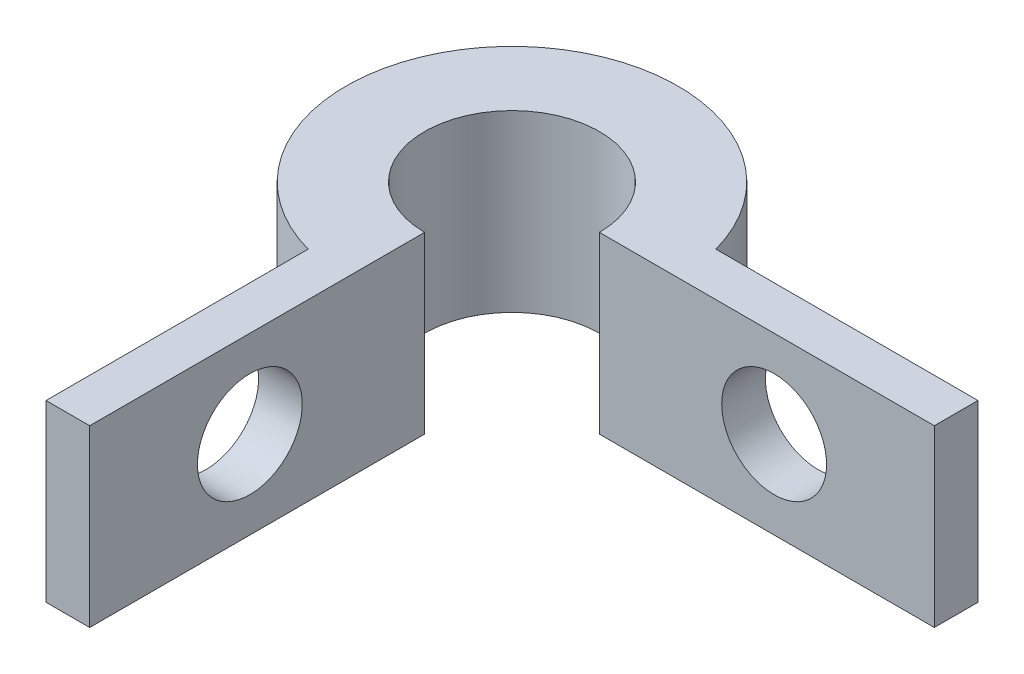
ISO-10303-21;
HEADER;
FILE_DESCRIPTION(('STEP AP214'),'2;1');
FILE_NAME('part.step','',(''),(''),'','','');
FILE_SCHEMA(('AUTOMOTIVE_DESIGN { 1 0 10303 214 1 1 1 1 }'));
ENDSEC;
DATA;
#1=APPLICATION_CONTEXT('core data for automotive mechanical design processes');
#2=APPLICATION_PROTOCOL_DEFINITION('international standard','automotive_design',2000,#1);
#3=PRODUCT_CONTEXT('',#1,'mechanical');
#4=PRODUCT('Part','Part','',(#3));
#5=PRODUCT_RELATED_PRODUCT_CATEGORY('part','',(#4));
#6=PRODUCT_DEFINITION_FORMATION('','',#4);
#7=PRODUCT_DEFINITION_CONTEXT('part definition',#1,'design');
#8=PRODUCT_DEFINITION('design','',#6,#7);
#9=PRODUCT_DEFINITION_SHAPE('','',#8);
#10=(LENGTH_UNIT() NAMED_UNIT(*) SI_UNIT(.MILLI.,.METRE.));
#11=(NAMED_UNIT(*) PLANE_ANGLE_UNIT() SI_UNIT($,.RADIAN.));
#12=(NAMED_UNIT(*) SI_UNIT($,.STERADIAN.) SOLID_ANGLE_UNIT());
#13=UNCERTAINTY_MEASURE_WITH_UNIT(LENGTH_MEASURE(1.E-05),#10,'distance_accuracy_value','');
#14=(GEOMETRIC_REPRESENTATION_CONTEXT(3) GLOBAL_UNCERTAINTY_ASSIGNED_CONTEXT((#13)) GLOBAL_UNIT_ASSIGNED_CONTEXT((#10,
#11,#12)) REPRESENTATION_CONTEXT('',''));
#15=CARTESIAN_POINT('',(0.,0.,0.));
#16=DIRECTION('',(0.,0.,1.));
#17=DIRECTION('',(1.,0.,0.));
#18=AXIS2_PLACEMENT_3D('',#15,#16,#17);
#19=CARTESIAN_POINT('',(0.,10.,0.));
#20=DIRECTION('',(0.,-1.,0.));
#21=DIRECTION('',(0.,0.,-1.));
#22=AXIS2_PLACEMENT_3D('',#19,#20,#21);
#23=CYLINDRICAL_SURFACE('',#22,9.5);
#24=CARTESIAN_POINT('',(0.,0.,0.));
#25=DIRECTION('',(0.,1.,0.));
#26=DIRECTION('',(0.,0.,1.));
#27=AXIS2_PLACEMENT_3D('',#24,#25,#26);
#28=CIRCLE('',#27,9.5);
#29=CARTESIAN_POINT('',(9.16515138991168,0.,-2.5));
#30=VERTEX_POINT('',#29);
#31=CARTESIAN_POINT('',(-2.5,0.,9.16515138991168));
#32=VERTEX_POINT('',#31);
#33=EDGE_CURVE('E148',#30,#32,#28,.T.);
#34=ORIENTED_EDGE('',*,*,#33,.T.);
#35=DIRECTION('',(0.,-1.,0.));
#36=VECTOR('',#35,1.);
#37=CARTESIAN_POINT('',(-2.5,10.,9.16515138991168));
#38=LINE('',#37,#36);
#39=CARTESIAN_POINT('',(-2.5,10.,9.16515138991168));
#40=VERTEX_POINT('',#39);
#41=EDGE_CURVE('E11',#40,#32,#38,.T.);
#42=ORIENTED_EDGE('',*,*,#41,.F.);
#43=CARTESIAN_POINT('',(0.,10.,0.));
#44=DIRECTION('',(0.,1.,0.));
#45=DIRECTION('',(0.,0.,1.));
#46=AXIS2_PLACEMENT_3D('',#43,#44,#45);
#47=CIRCLE('',#46,9.5);
#48=CARTESIAN_POINT('',(9.16515138991168,10.,-2.5));
#49=VERTEX_POINT('',#48);
#50=EDGE_CURVE('E171',#49,#40,#47,.T.);
#51=ORIENTED_EDGE('',*,*,#50,.F.);
#52=DIRECTION('',(0.,-1.,0.));
#53=VECTOR('',#52,1.);
#54=CARTESIAN_POINT('',(9.16515138991168,10.,-2.5));
#55=LINE('',#54,#53);
#56=EDGE_CURVE('E144',#49,#30,#55,.T.);
#57=ORIENTED_EDGE('',*,*,#56,.T.);
#58=EDGE_LOOP('',(#34,#42,#51,#57));
#59=FACE_BOUND('',#58,.T.);
#60=ADVANCED_FACE('F45',(#59),#23,.T.);
#61=CARTESIAN_POINT('',(-2.49999999999999,10.,24.1651513899117));
#62=DIRECTION('',(1.,0.,0.));
#63=DIRECTION('',(0.,0.,-1.));
#64=AXIS2_PLACEMENT_3D('',#61,#62,#63);
#65=PLANE('',#64);
#66=CARTESIAN_POINT('',(-2.5,5.,15.));
#67=DIRECTION('',(-1.,0.,0.));
#68=DIRECTION('',(0.,0.,1.));
#69=AXIS2_PLACEMENT_3D('',#66,#67,#68);
#70=CIRCLE('',#69,2.99999999999999);
#71=CARTESIAN_POINT('',(-2.5,5.,18.));
#72=VERTEX_POINT('',#71);
#73=EDGE_CURVE('E190',#72,#72,#70,.T.);
#74=ORIENTED_EDGE('',*,*,#73,.F.);
#75=EDGE_LOOP('',(#74));
#76=FACE_BOUND('',#75,.T.);
#77=DIRECTION('',(0.,0.,1.));
#78=VECTOR('',#77,1.);
#79=CARTESIAN_POINT('',(-2.49999999999999,0.,24.1651513899117));
#80=LINE('',#79,#78);
#81=CARTESIAN_POINT('',(-2.49999999999999,0.,24.1651513899117));
#82=VERTEX_POINT('',#81);
#83=EDGE_CURVE('E152',#32,#82,#80,.T.);
#84=ORIENTED_EDGE('',*,*,#83,.T.);
#85=DIRECTION('',(0.,-1.,0.));
#86=VECTOR('',#85,1.);
#87=CARTESIAN_POINT('',(-2.49999999999999,10.,24.1651513899117));
#88=LINE('',#87,#86);
#89=CARTESIAN_POINT('',(-2.49999999999999,10.,24.1651513899117));
#90=VERTEX_POINT('',#89);
#91=EDGE_CURVE('E55',#90,#82,#88,.T.);
#92=ORIENTED_EDGE('',*,*,#91,.F.);
#93=DIRECTION('',(0.,0.,1.));
#94=VECTOR('',#93,1.);
#95=CARTESIAN_POINT('',(-2.49999999999999,10.,24.1651513899117));
#96=LINE('',#95,#94);
#97=EDGE_CURVE('E107',#40,#90,#96,.T.);
#98=ORIENTED_EDGE('',*,*,#97,.F.);
#99=ORIENTED_EDGE('',*,*,#41,.T.);
#100=EDGE_LOOP('',(#84,#92,#98,#99));
#101=FACE_BOUND('',#100,.T.);
#102=ADVANCED_FACE('F245',(#76,#101),#65,.F.);
#103=CARTESIAN_POINT('',(0.,10.,24.1651513899117));
#104=DIRECTION('',(0.,0.,-1.));
#105=DIRECTION('',(-1.,0.,0.));
#106=AXIS2_PLACEMENT_3D('',#103,#104,#105);
#107=PLANE('',#106);
#108=DIRECTION('',(1.,0.,0.));
#109=VECTOR('',#108,1.);
#110=CARTESIAN_POINT('',(0.,0.,24.1651513899117));
#111=LINE('',#110,#109);
#112=CARTESIAN_POINT('',(0.,0.,24.1651513899117));
#113=VERTEX_POINT('',#112);
#114=EDGE_CURVE('E156',#82,#113,#111,.T.);
#115=ORIENTED_EDGE('',*,*,#114,.T.);
#116=DIRECTION('',(0.,-1.,0.));
#117=VECTOR('',#116,1.);
#118=CARTESIAN_POINT('',(0.,10.,24.1651513899117));
#119=LINE('',#118,#117);
#120=CARTESIAN_POINT('',(0.,10.,24.1651513899117));
#121=VERTEX_POINT('',#120);
#122=EDGE_CURVE('E182',#121,#113,#119,.T.);
#123=ORIENTED_EDGE('',*,*,#122,.F.);
#124=DIRECTION('',(1.,0.,0.));
#125=VECTOR('',#124,1.);
#126=CARTESIAN_POINT('',(0.,10.,24.1651513899117));
#127=LINE('',#126,#125);
#128=EDGE_CURVE('E207',#90,#121,#127,.T.);
#129=ORIENTED_EDGE('',*,*,#128,.F.);
#130=ORIENTED_EDGE('',*,*,#91,.T.);
#131=EDGE_LOOP('',(#115,#123,#129,#130));
#132=FACE_BOUND('',#131,.T.);
#133=ADVANCED_FACE('F250',(#132),#107,.F.);
#134=CARTESIAN_POINT('',(0.,10.,24.1651513899117));
#135=DIRECTION('',(-1.,0.,0.));
#136=DIRECTION('',(0.,0.,1.));
#137=AXIS2_PLACEMENT_3D('',#134,#135,#136);
#138=PLANE('',#137);
#139=CARTESIAN_POINT('',(0.,5.,15.));
#140=DIRECTION('',(-1.,0.,0.));
#141=DIRECTION('',(0.,0.,1.));
#142=AXIS2_PLACEMENT_3D('',#139,#140,#141);
#143=CIRCLE('',#142,2.99999999999999);
#144=CARTESIAN_POINT('',(0.,5.,18.));
#145=VERTEX_POINT('',#144);
#146=EDGE_CURVE('E153',#145,#145,#143,.T.);
#147=ORIENTED_EDGE('',*,*,#146,.T.);
#148=EDGE_LOOP('',(#147));
#149=FACE_BOUND('',#148,.T.);
#150=DIRECTION('',(0.,0.,-1.));
#151=VECTOR('',#150,1.);
#152=CARTESIAN_POINT('',(0.,0.,24.1651513899117));
#153=LINE('',#152,#151);
#154=CARTESIAN_POINT('',(0.,0.,5.));
#155=VERTEX_POINT('',#154);
#156=EDGE_CURVE('E159',#113,#155,#153,.T.);
#157=ORIENTED_EDGE('',*,*,#156,.T.);
#158=DIRECTION('',(0.,-1.,0.));
#159=VECTOR('',#158,1.);
#160=CARTESIAN_POINT('',(0.,10.,5.));
#161=LINE('',#160,#159);
#162=CARTESIAN_POINT('',(0.,10.,5.));
#163=VERTEX_POINT('',#162);
#164=EDGE_CURVE('E178',#163,#155,#161,.T.);
#165=ORIENTED_EDGE('',*,*,#164,.F.);
#166=DIRECTION('',(0.,0.,-1.));
#167=VECTOR('',#166,1.);
#168=CARTESIAN_POINT('',(0.,10.,24.1651513899117));
#169=LINE('',#168,#167);
#170=EDGE_CURVE('E210',#121,#163,#169,.T.);
#171=ORIENTED_EDGE('',*,*,#170,.F.);
#172=ORIENTED_EDGE('',*,*,#122,.T.);
#173=EDGE_LOOP('',(#157,#165,#171,#172));
#174=FACE_BOUND('',#173,.T.);
#175=ADVANCED_FACE('F218',(#149,#174),#138,.F.);
#176=CARTESIAN_POINT('',(0.,10.,0.));
#177=DIRECTION('',(0.,-1.,0.));
#178=DIRECTION('',(0.,0.,-1.));
#179=AXIS2_PLACEMENT_3D('',#176,#177,#178);
#180=CYLINDRICAL_SURFACE('',#179,5.);
#181=CARTESIAN_POINT('',(0.,0.,0.));
#182=DIRECTION('',(0.,-1.,0.));
#183=DIRECTION('',(0.,0.,1.));
#184=AXIS2_PLACEMENT_3D('',#181,#182,#183);
#185=CIRCLE('',#184,5.);
#186=CARTESIAN_POINT('',(5.,0.,0.));
#187=VERTEX_POINT('',#186);
#188=EDGE_CURVE('E162',#155,#187,#185,.T.);
#189=ORIENTED_EDGE('',*,*,#188,.T.);
#190=DIRECTION('',(0.,-1.,0.));
#191=VECTOR('',#190,1.);
#192=CARTESIAN_POINT('',(5.,10.,0.));
#193=LINE('',#192,#191);
#194=CARTESIAN_POINT('',(5.,10.,0.));
#195=VERTEX_POINT('',#194);
#196=EDGE_CURVE('E137',#195,#187,#193,.T.);
#197=ORIENTED_EDGE('',*,*,#196,.F.);
#198=CARTESIAN_POINT('',(0.,10.,0.));
#199=DIRECTION('',(0.,-1.,0.));
#200=DIRECTION('',(0.,0.,1.));
#201=AXIS2_PLACEMENT_3D('',#198,#199,#200);
#202=CIRCLE('',#201,5.);
#203=EDGE_CURVE('E126',#163,#195,#202,.T.);
#204=ORIENTED_EDGE('',*,*,#203,.F.);
#205=ORIENTED_EDGE('',*,*,#164,.T.);
#206=EDGE_LOOP('',(#189,#197,#204,#205));
#207=FACE_BOUND('',#206,.T.);
#208=ADVANCED_FACE('F222',(#207),#180,.F.);
#209=CARTESIAN_POINT('',(5.,10.,0.));
#210=DIRECTION('',(0.,0.,-1.));
#211=DIRECTION('',(-1.,0.,0.));
#212=AXIS2_PLACEMENT_3D('',#209,#210,#211);
#213=PLANE('',#212);
#214=CARTESIAN_POINT('',(15.,5.,0.));
#215=DIRECTION('',(0.,0.,-1.));
#216=DIRECTION('',(-1.,0.,0.));
#217=AXIS2_PLACEMENT_3D('',#214,#215,#216);
#218=CIRCLE('',#217,2.99999999999999);
#219=CARTESIAN_POINT('',(12.,5.,0.));
#220=VERTEX_POINT('',#219);
#221=EDGE_CURVE('E195',#220,#220,#218,.T.);
#222=ORIENTED_EDGE('',*,*,#221,.T.);
#223=EDGE_LOOP('',(#222));
#224=FACE_BOUND('',#223,.T.);
#225=DIRECTION('',(1.,0.,0.));
#226=VECTOR('',#225,1.);
#227=CARTESIAN_POINT('',(5.,0.,0.));
#228=LINE('',#227,#226);
#229=CARTESIAN_POINT('',(24.1651513899117,0.,0.));
#230=VERTEX_POINT('',#229);
#231=EDGE_CURVE('E135',#187,#230,#228,.T.);
#232=ORIENTED_EDGE('',*,*,#231,.T.);
#233=DIRECTION('',(0.,-1.,0.));
#234=VECTOR('',#233,1.);
#235=CARTESIAN_POINT('',(24.1651513899117,10.,0.));
#236=LINE('',#235,#234);
#237=CARTESIAN_POINT('',(24.1651513899117,10.,0.));
#238=VERTEX_POINT('',#237);
#239=EDGE_CURVE('E132',#238,#230,#236,.T.);
#240=ORIENTED_EDGE('',*,*,#239,.F.);
#241=DIRECTION('',(1.,0.,0.));
#242=VECTOR('',#241,1.);
#243=CARTESIAN_POINT('',(5.,10.,0.));
#244=LINE('',#243,#242);
#245=EDGE_CURVE('E120',#195,#238,#244,.T.);
#246=ORIENTED_EDGE('',*,*,#245,.F.);
#247=ORIENTED_EDGE('',*,*,#196,.T.);
#248=EDGE_LOOP('',(#232,#240,#246,#247));
#249=FACE_BOUND('',#248,.T.);
#250=ADVANCED_FACE('F133',(#224,#249),#213,.F.);
#251=CARTESIAN_POINT('',(24.1651513899117,10.,0.));
#252=DIRECTION('',(-1.,0.,0.));
#253=DIRECTION('',(0.,0.,1.));
#254=AXIS2_PLACEMENT_3D('',#251,#252,#253);
#255=PLANE('',#254);
#256=DIRECTION('',(0.,0.,-1.));
#257=VECTOR('',#256,1.);
#258=CARTESIAN_POINT('',(24.1651513899117,0.,0.));
#259=LINE('',#258,#257);
#260=CARTESIAN_POINT('',(24.1651513899117,0.,-2.50000000000002));
#261=VERTEX_POINT('',#260);
#262=EDGE_CURVE('E93',#230,#261,#259,.T.);
#263=ORIENTED_EDGE('',*,*,#262,.T.);
#264=DIRECTION('',(0.,-1.,0.));
#265=VECTOR('',#264,1.);
#266=CARTESIAN_POINT('',(24.1651513899117,10.,-2.50000000000002));
#267=LINE('',#266,#265);
#268=CARTESIAN_POINT('',(24.1651513899117,10.,-2.50000000000002));
#269=VERTEX_POINT('',#268);
#270=EDGE_CURVE('E138',#269,#261,#267,.T.);
#271=ORIENTED_EDGE('',*,*,#270,.F.);
#272=DIRECTION('',(0.,0.,-1.));
#273=VECTOR('',#272,1.);
#274=CARTESIAN_POINT('',(24.1651513899117,10.,0.));
#275=LINE('',#274,#273);
#276=EDGE_CURVE('E124',#238,#269,#275,.T.);
#277=ORIENTED_EDGE('',*,*,#276,.F.);
#278=ORIENTED_EDGE('',*,*,#239,.T.);
#279=EDGE_LOOP('',(#263,#271,#277,#278));
#280=FACE_BOUND('',#279,.T.);
#281=ADVANCED_FACE('F140',(#280),#255,.F.);
#282=CARTESIAN_POINT('',(24.1651513899117,10.,-2.50000000000002));
#283=DIRECTION('',(0.,0.,1.));
#284=DIRECTION('',(1.,0.,0.));
#285=AXIS2_PLACEMENT_3D('',#282,#283,#284);
#286=PLANE('',#285);
#287=CARTESIAN_POINT('',(15.,5.,-2.50000000000001));
#288=DIRECTION('',(0.,0.,1.));
#289=DIRECTION('',(1.,0.,0.));
#290=AXIS2_PLACEMENT_3D('',#287,#288,#289);
#291=CIRCLE('',#290,2.99999999999999);
#292=CARTESIAN_POINT('',(18.,5.,-2.50000000000001));
#293=VERTEX_POINT('',#292);
#294=EDGE_CURVE('E48',#293,#293,#291,.T.);
#295=ORIENTED_EDGE('',*,*,#294,.T.);
#296=EDGE_LOOP('',(#295));
#297=FACE_BOUND('',#296,.T.);
#298=DIRECTION('',(-1.,0.,0.));
#299=VECTOR('',#298,1.);
#300=CARTESIAN_POINT('',(24.1651513899117,0.,-2.50000000000002));
#301=LINE('',#300,#299);
#302=EDGE_CURVE('E99',#261,#30,#301,.T.);
#303=ORIENTED_EDGE('',*,*,#302,.T.);
#304=ORIENTED_EDGE('',*,*,#56,.F.);
#305=DIRECTION('',(-1.,0.,0.));
#306=VECTOR('',#305,1.);
#307=CARTESIAN_POINT('',(24.1651513899117,10.,-2.50000000000002));
#308=LINE('',#307,#306);
#309=EDGE_CURVE('E64',#269,#49,#308,.T.);
#310=ORIENTED_EDGE('',*,*,#309,.F.);
#311=ORIENTED_EDGE('',*,*,#270,.T.);
#312=EDGE_LOOP('',(#303,#304,#310,#311));
#313=FACE_BOUND('',#312,.T.);
#314=ADVANCED_FACE('F230',(#297,#313),#286,.F.);
#315=CARTESIAN_POINT('',(0.,10.,0.));
#316=DIRECTION('',(0.,1.,0.));
#317=DIRECTION('',(0.,0.,1.));
#318=AXIS2_PLACEMENT_3D('',#315,#316,#317);
#319=PLANE('',#318);
#320=ORIENTED_EDGE('',*,*,#50,.T.);
#321=ORIENTED_EDGE('',*,*,#97,.T.);
#322=ORIENTED_EDGE('',*,*,#128,.T.);
#323=ORIENTED_EDGE('',*,*,#170,.T.);
#324=ORIENTED_EDGE('',*,*,#203,.T.);
#325=ORIENTED_EDGE('',*,*,#245,.T.);
#326=ORIENTED_EDGE('',*,*,#276,.T.);
#327=ORIENTED_EDGE('',*,*,#309,.T.);
#328=EDGE_LOOP('',(#320,#321,#322,#323,#324,#325,#326,#327));
#329=FACE_BOUND('',#328,.T.);
#330=ADVANCED_FACE('F122',(#329),#319,.T.);
#331=CARTESIAN_POINT('',(0.,0.,0.));
#332=DIRECTION('',(0.,1.,0.));
#333=DIRECTION('',(0.,0.,1.));
#334=AXIS2_PLACEMENT_3D('',#331,#332,#333);
#335=PLANE('',#334);
#336=ORIENTED_EDGE('',*,*,#33,.F.);
#337=ORIENTED_EDGE('',*,*,#302,.F.);
#338=ORIENTED_EDGE('',*,*,#262,.F.);
#339=ORIENTED_EDGE('',*,*,#231,.F.);
#340=ORIENTED_EDGE('',*,*,#188,.F.);
#341=ORIENTED_EDGE('',*,*,#156,.F.);
#342=ORIENTED_EDGE('',*,*,#114,.F.);
#343=ORIENTED_EDGE('',*,*,#83,.F.);
#344=EDGE_LOOP('',(#336,#337,#338,#339,#340,#341,#342,#343));
#345=FACE_BOUND('',#344,.T.);
#346=ADVANCED_FACE('F225',(#345),#335,.F.);
#347=CARTESIAN_POINT('',(24.1651513899117,5.,15.));
#348=DIRECTION('',(-1.,0.,0.));
#349=DIRECTION('',(0.,0.,1.));
#350=AXIS2_PLACEMENT_3D('',#347,#348,#349);
#351=CYLINDRICAL_SURFACE('',#350,2.99999999999999);
#352=ORIENTED_EDGE('',*,*,#73,.T.);
#353=EDGE_LOOP('',(#352));
#354=FACE_BOUND('',#353,.T.);
#355=ORIENTED_EDGE('',*,*,#146,.F.);
#356=EDGE_LOOP('',(#355));
#357=FACE_BOUND('',#356,.T.);
#358=ADVANCED_FACE('F269',(#354,#357),#351,.F.);
#359=CARTESIAN_POINT('',(15.,5.,-9.5000000000001));
#360=DIRECTION('',(0.,0.,1.));
#361=DIRECTION('',(1.,0.,0.));
#362=AXIS2_PLACEMENT_3D('',#359,#360,#361);
#363=CYLINDRICAL_SURFACE('',#362,2.99999999999999);
#364=ORIENTED_EDGE('',*,*,#294,.F.);
#365=EDGE_LOOP('',(#364));
#366=FACE_BOUND('',#365,.T.);
#367=ORIENTED_EDGE('',*,*,#221,.F.);
#368=EDGE_LOOP('',(#367));
#369=FACE_BOUND('',#368,.T.);
#370=ADVANCED_FACE('F268',(#366,#369),#363,.F.);
#371=CLOSED_SHELL('',(#60,#102,#133,#175,#208,#250,#281,#314,#330,#346,#358,#370));
#372=MANIFOLD_SOLID_BREP('B2',#371);
#373=ADVANCED_BREP_SHAPE_REPRESENTATION('',(#18,#372),#14);
#374=SHAPE_DEFINITION_REPRESENTATION(#9,#373);
ENDSEC;
END-ISO-10303-21;
